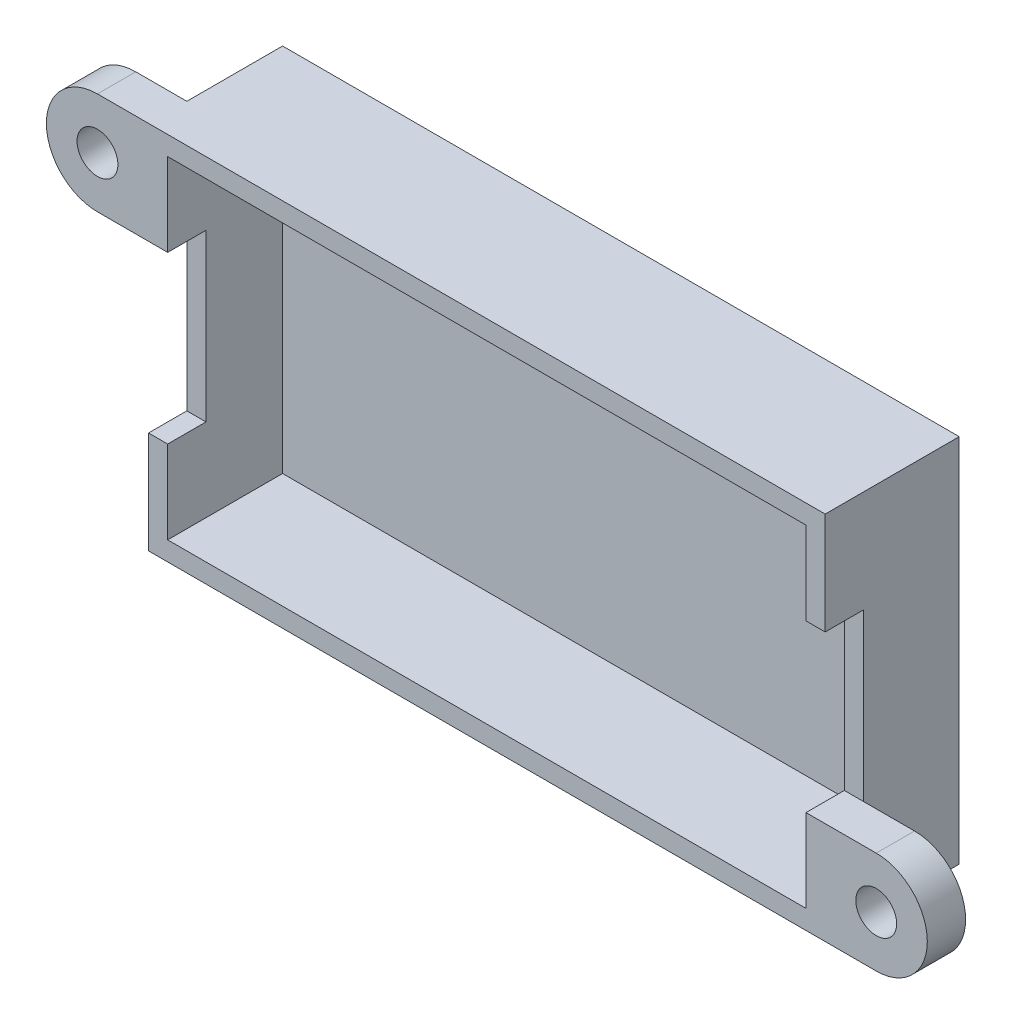
ISO-10303-21;
HEADER;
FILE_DESCRIPTION(('STEP AP214'),'2;1');
FILE_NAME('part.step','',(''),(''),'','','');
FILE_SCHEMA(('AUTOMOTIVE_DESIGN { 1 0 10303 214 1 1 1 1 }'));
ENDSEC;
DATA;
#1=APPLICATION_CONTEXT('core data for automotive mechanical design processes');
#2=APPLICATION_PROTOCOL_DEFINITION('international standard','automotive_design',2000,#1);
#3=PRODUCT_CONTEXT('',#1,'mechanical');
#4=PRODUCT('Part','Part','',(#3));
#5=PRODUCT_RELATED_PRODUCT_CATEGORY('part','',(#4));
#6=PRODUCT_DEFINITION_FORMATION('','',#4);
#7=PRODUCT_DEFINITION_CONTEXT('part definition',#1,'design');
#8=PRODUCT_DEFINITION('design','',#6,#7);
#9=PRODUCT_DEFINITION_SHAPE('','',#8);
#10=(LENGTH_UNIT() NAMED_UNIT(*) SI_UNIT(.MILLI.,.METRE.));
#11=(NAMED_UNIT(*) PLANE_ANGLE_UNIT() SI_UNIT($,.RADIAN.));
#12=(NAMED_UNIT(*) SI_UNIT($,.STERADIAN.) SOLID_ANGLE_UNIT());
#13=UNCERTAINTY_MEASURE_WITH_UNIT(LENGTH_MEASURE(1.E-05),#10,'distance_accuracy_value','');
#14=(GEOMETRIC_REPRESENTATION_CONTEXT(3) GLOBAL_UNCERTAINTY_ASSIGNED_CONTEXT((#13)) GLOBAL_UNIT_ASSIGNED_CONTEXT((#10,
#11,#12)) REPRESENTATION_CONTEXT('',''));
#15=CARTESIAN_POINT('',(0.,0.,0.));
#16=DIRECTION('',(0.,0.,1.));
#17=DIRECTION('',(1.,0.,0.));
#18=AXIS2_PLACEMENT_3D('',#15,#16,#17);
#19=CARTESIAN_POINT('',(0.,0.,10.5));
#20=DIRECTION('',(0.,0.,-1.));
#21=DIRECTION('',(-1.,0.,0.));
#22=AXIS2_PLACEMENT_3D('',#19,#20,#21);
#23=PLANE('',#22);
#24=CARTESIAN_POINT('',(30.5,-10.5,10.5));
#25=DIRECTION('',(0.,0.,1.));
#26=DIRECTION('',(1.,0.,0.));
#27=AXIS2_PLACEMENT_3D('',#24,#25,#26);
#28=CIRCLE('',#27,1.6);
#29=CARTESIAN_POINT('',(32.1,-10.5,10.5));
#30=VERTEX_POINT('',#29);
#31=EDGE_CURVE('E368',#30,#30,#28,.T.);
#32=ORIENTED_EDGE('',*,*,#31,.F.);
#33=EDGE_LOOP('',(#32));
#34=FACE_BOUND('',#33,.T.);
#35=DIRECTION('',(-1.,0.,0.));
#36=VECTOR('',#35,1.);
#37=CARTESIAN_POINT('',(26.5,-6.5,10.5));
#38=LINE('',#37,#36);
#39=CARTESIAN_POINT('',(30.5,-6.5,10.5));
#40=VERTEX_POINT('',#39);
#41=CARTESIAN_POINT('',(25.,-6.5,10.5));
#42=VERTEX_POINT('',#41);
#43=EDGE_CURVE('E354',#40,#42,#38,.T.);
#44=ORIENTED_EDGE('',*,*,#43,.T.);
#45=DIRECTION('',(0.,1.,0.));
#46=VECTOR('',#45,1.);
#47=CARTESIAN_POINT('',(25.,0.,10.5));
#48=LINE('',#47,#46);
#49=CARTESIAN_POINT('',(25.,-13.,10.5));
#50=VERTEX_POINT('',#49);
#51=EDGE_CURVE('E261',#50,#42,#48,.T.);
#52=ORIENTED_EDGE('',*,*,#51,.F.);
#53=DIRECTION('',(1.,0.,0.));
#54=VECTOR('',#53,1.);
#55=CARTESIAN_POINT('',(0.,-13.,10.5));
#56=LINE('',#55,#54);
#57=CARTESIAN_POINT('',(-25.,-13.,10.5));
#58=VERTEX_POINT('',#57);
#59=EDGE_CURVE('E245',#58,#50,#56,.T.);
#60=ORIENTED_EDGE('',*,*,#59,.F.);
#61=DIRECTION('',(0.,-1.,0.));
#62=VECTOR('',#61,1.);
#63=CARTESIAN_POINT('',(-25.,0.,10.5));
#64=LINE('',#63,#62);
#65=CARTESIAN_POINT('',(-25.,-6.5,10.5));
#66=VERTEX_POINT('',#65);
#67=EDGE_CURVE('E268',#66,#58,#64,.T.);
#68=ORIENTED_EDGE('',*,*,#67,.F.);
#69=DIRECTION('',(-1.,0.,0.));
#70=VECTOR('',#69,1.);
#71=CARTESIAN_POINT('',(39.8416640641263,-6.5,10.5));
#72=LINE('',#71,#70);
#73=CARTESIAN_POINT('',(-26.5,-6.5,10.5));
#74=VERTEX_POINT('',#73);
#75=EDGE_CURVE('E656',#66,#74,#72,.T.);
#76=ORIENTED_EDGE('',*,*,#75,.T.);
#77=DIRECTION('',(0.,-1.,0.));
#78=VECTOR('',#77,1.);
#79=CARTESIAN_POINT('',(-26.5,-14.5,10.5));
#80=LINE('',#79,#78);
#81=CARTESIAN_POINT('',(-26.5,-14.5,10.5));
#82=VERTEX_POINT('',#81);
#83=EDGE_CURVE('E282',#74,#82,#80,.T.);
#84=ORIENTED_EDGE('',*,*,#83,.T.);
#85=DIRECTION('',(1.,0.,0.));
#86=VECTOR('',#85,1.);
#87=CARTESIAN_POINT('',(-26.5,-14.5,10.5));
#88=LINE('',#87,#86);
#89=CARTESIAN_POINT('',(30.5,-14.5,10.5));
#90=VERTEX_POINT('',#89);
#91=EDGE_CURVE('E285',#82,#90,#88,.T.);
#92=ORIENTED_EDGE('',*,*,#91,.T.);
#93=CARTESIAN_POINT('',(30.5,-10.5,10.5));
#94=DIRECTION('',(0.,0.,1.));
#95=DIRECTION('',(1.,0.,0.));
#96=AXIS2_PLACEMENT_3D('',#93,#94,#95);
#97=CIRCLE('',#96,4.);
#98=EDGE_CURVE('E357',#90,#40,#97,.T.);
#99=ORIENTED_EDGE('',*,*,#98,.T.);
#100=EDGE_LOOP('',(#44,#52,#60,#68,#76,#84,#92,#99));
#101=FACE_BOUND('',#100,.T.);
#102=ADVANCED_FACE('F41',(#34,#101),#23,.F.);
#103=CARTESIAN_POINT('',(26.5,-14.5,10.5));
#104=DIRECTION('',(-1.,0.,0.));
#105=DIRECTION('',(0.,0.,1.));
#106=AXIS2_PLACEMENT_3D('',#103,#104,#105);
#107=PLANE('',#106);
#108=DIRECTION('',(0.,0.,1.));
#109=VECTOR('',#108,1.);
#110=CARTESIAN_POINT('',(26.5,6.5,10.5));
#111=LINE('',#110,#109);
#112=CARTESIAN_POINT('',(26.5,6.5,7.5));
#113=VERTEX_POINT('',#112);
#114=CARTESIAN_POINT('',(26.5,6.5,10.5));
#115=VERTEX_POINT('',#114);
#116=EDGE_CURVE('E667',#113,#115,#111,.T.);
#117=ORIENTED_EDGE('',*,*,#116,.F.);
#118=DIRECTION('',(0.,1.,0.));
#119=VECTOR('',#118,1.);
#120=CARTESIAN_POINT('',(26.5,6.5,7.5));
#121=LINE('',#120,#119);
#122=CARTESIAN_POINT('',(26.5,-6.5,7.5));
#123=VERTEX_POINT('',#122);
#124=EDGE_CURVE('E669',#123,#113,#121,.T.);
#125=ORIENTED_EDGE('',*,*,#124,.F.);
#126=DIRECTION('',(0.,-1.,0.));
#127=VECTOR('',#126,1.);
#128=CARTESIAN_POINT('',(26.5,-6.5,7.5));
#129=LINE('',#128,#127);
#130=CARTESIAN_POINT('',(26.5,-14.5,7.5));
#131=VERTEX_POINT('',#130);
#132=EDGE_CURVE('E360',#123,#131,#129,.T.);
#133=ORIENTED_EDGE('',*,*,#132,.T.);
#134=DIRECTION('',(0.,0.,-1.));
#135=VECTOR('',#134,1.);
#136=CARTESIAN_POINT('',(26.5,-14.5,10.5));
#137=LINE('',#136,#135);
#138=CARTESIAN_POINT('',(26.5,-14.5,0.));
#139=VERTEX_POINT('',#138);
#140=EDGE_CURVE('E288',#131,#139,#137,.T.);
#141=ORIENTED_EDGE('',*,*,#140,.T.);
#142=DIRECTION('',(0.,1.,0.));
#143=VECTOR('',#142,1.);
#144=CARTESIAN_POINT('',(26.5,-14.5,0.));
#145=LINE('',#144,#143);
#146=CARTESIAN_POINT('',(26.5,14.5,0.));
#147=VERTEX_POINT('',#146);
#148=EDGE_CURVE('E238',#139,#147,#145,.T.);
#149=ORIENTED_EDGE('',*,*,#148,.T.);
#150=DIRECTION('',(0.,0.,-1.));
#151=VECTOR('',#150,1.);
#152=CARTESIAN_POINT('',(26.5,14.5,10.5));
#153=LINE('',#152,#151);
#154=CARTESIAN_POINT('',(26.5,14.5,10.5));
#155=VERTEX_POINT('',#154);
#156=EDGE_CURVE('E311',#155,#147,#153,.T.);
#157=ORIENTED_EDGE('',*,*,#156,.F.);
#158=DIRECTION('',(0.,1.,0.));
#159=VECTOR('',#158,1.);
#160=CARTESIAN_POINT('',(26.5,-14.5,10.5));
#161=LINE('',#160,#159);
#162=EDGE_CURVE('E275',#115,#155,#161,.T.);
#163=ORIENTED_EDGE('',*,*,#162,.F.);
#164=EDGE_LOOP('',(#117,#125,#133,#141,#149,#157,#163));
#165=FACE_BOUND('',#164,.T.);
#166=ADVANCED_FACE('F43',(#165),#107,.F.);
#167=CARTESIAN_POINT('',(-26.5,-14.5,10.5));
#168=DIRECTION('',(1.,0.,0.));
#169=DIRECTION('',(0.,0.,-1.));
#170=AXIS2_PLACEMENT_3D('',#167,#168,#169);
#171=PLANE('',#170);
#172=ORIENTED_EDGE('',*,*,#83,.F.);
#173=DIRECTION('',(0.,0.,1.));
#174=VECTOR('',#173,1.);
#175=CARTESIAN_POINT('',(-26.5,-6.5,10.5));
#176=LINE('',#175,#174);
#177=CARTESIAN_POINT('',(-26.5,-6.5,7.5));
#178=VERTEX_POINT('',#177);
#179=EDGE_CURVE('E196',#178,#74,#176,.T.);
#180=ORIENTED_EDGE('',*,*,#179,.F.);
#181=DIRECTION('',(0.,-1.,0.));
#182=VECTOR('',#181,1.);
#183=CARTESIAN_POINT('',(-26.5,6.5,7.5));
#184=LINE('',#183,#182);
#185=CARTESIAN_POINT('',(-26.5,6.5,7.5));
#186=VERTEX_POINT('',#185);
#187=EDGE_CURVE('E180',#186,#178,#184,.T.);
#188=ORIENTED_EDGE('',*,*,#187,.F.);
#189=DIRECTION('',(0.,1.,0.));
#190=VECTOR('',#189,1.);
#191=CARTESIAN_POINT('',(-26.5,14.5,7.5));
#192=LINE('',#191,#190);
#193=CARTESIAN_POINT('',(-26.5,14.5,7.5));
#194=VERTEX_POINT('',#193);
#195=EDGE_CURVE('E194',#186,#194,#192,.T.);
#196=ORIENTED_EDGE('',*,*,#195,.T.);
#197=DIRECTION('',(0.,0.,-1.));
#198=VECTOR('',#197,1.);
#199=CARTESIAN_POINT('',(-26.5,14.5,10.5));
#200=LINE('',#199,#198);
#201=CARTESIAN_POINT('',(-26.5,14.5,0.));
#202=VERTEX_POINT('',#201);
#203=EDGE_CURVE('E308',#194,#202,#200,.T.);
#204=ORIENTED_EDGE('',*,*,#203,.T.);
#205=DIRECTION('',(0.,-1.,0.));
#206=VECTOR('',#205,1.);
#207=CARTESIAN_POINT('',(-26.5,-14.5,0.));
#208=LINE('',#207,#206);
#209=CARTESIAN_POINT('',(-26.5,-14.5,0.));
#210=VERTEX_POINT('',#209);
#211=EDGE_CURVE('E296',#202,#210,#208,.T.);
#212=ORIENTED_EDGE('',*,*,#211,.T.);
#213=DIRECTION('',(0.,0.,-1.));
#214=VECTOR('',#213,1.);
#215=CARTESIAN_POINT('',(-26.5,-14.5,10.5));
#216=LINE('',#215,#214);
#217=EDGE_CURVE('E304',#82,#210,#216,.T.);
#218=ORIENTED_EDGE('',*,*,#217,.F.);
#219=EDGE_LOOP('',(#172,#180,#188,#196,#204,#212,#218));
#220=FACE_BOUND('',#219,.T.);
#221=ADVANCED_FACE('F193',(#220),#171,.F.);
#222=DIRECTION('',(1.,0.,0.));
#223=VECTOR('',#222,1.);
#224=CARTESIAN_POINT('',(-26.5,6.5,10.5));
#225=LINE('',#224,#223);
#226=CARTESIAN_POINT('',(-30.5,6.5,10.5));
#227=VERTEX_POINT('',#226);
#228=CARTESIAN_POINT('',(-25.,6.5,10.5));
#229=VERTEX_POINT('',#228);
#230=EDGE_CURVE('E203',#227,#229,#225,.T.);
#231=ORIENTED_EDGE('',*,*,#230,.T.);
#232=CARTESIAN_POINT('',(-25.,13.,10.5));
#233=VERTEX_POINT('',#232);
#234=EDGE_CURVE('E269',#233,#229,#64,.T.);
#235=ORIENTED_EDGE('',*,*,#234,.F.);
#236=DIRECTION('',(-1.,0.,0.));
#237=VECTOR('',#236,1.);
#238=CARTESIAN_POINT('',(0.,13.,10.5));
#239=LINE('',#238,#237);
#240=CARTESIAN_POINT('',(25.,13.,10.5));
#241=VERTEX_POINT('',#240);
#242=EDGE_CURVE('E265',#241,#233,#239,.T.);
#243=ORIENTED_EDGE('',*,*,#242,.F.);
#244=CARTESIAN_POINT('',(25.,6.5,10.5));
#245=VERTEX_POINT('',#244);
#246=EDGE_CURVE('E260',#245,#241,#48,.T.);
#247=ORIENTED_EDGE('',*,*,#246,.F.);
#248=DIRECTION('',(-1.,0.,0.));
#249=VECTOR('',#248,1.);
#250=CARTESIAN_POINT('',(39.8416640641263,6.5,10.5));
#251=LINE('',#250,#249);
#252=EDGE_CURVE('E189',#115,#245,#251,.T.);
#253=ORIENTED_EDGE('',*,*,#252,.F.);
#254=ORIENTED_EDGE('',*,*,#162,.T.);
#255=DIRECTION('',(-1.,0.,0.));
#256=VECTOR('',#255,1.);
#257=CARTESIAN_POINT('',(-26.5,14.5,10.5));
#258=LINE('',#257,#256);
#259=CARTESIAN_POINT('',(-30.5,14.5,10.5));
#260=VERTEX_POINT('',#259);
#261=EDGE_CURVE('E278',#155,#260,#258,.T.);
#262=ORIENTED_EDGE('',*,*,#261,.T.);
#263=CARTESIAN_POINT('',(-30.5,10.5,10.5));
#264=DIRECTION('',(0.,0.,1.));
#265=DIRECTION('',(1.,0.,0.));
#266=AXIS2_PLACEMENT_3D('',#263,#264,#265);
#267=CIRCLE('',#266,4.);
#268=EDGE_CURVE('E220',#260,#227,#267,.T.);
#269=ORIENTED_EDGE('',*,*,#268,.T.);
#270=EDGE_LOOP('',(#231,#235,#243,#247,#253,#254,#262,#269));
#271=FACE_BOUND('',#270,.T.);
#272=CARTESIAN_POINT('',(-30.5,10.5,10.5));
#273=DIRECTION('',(0.,0.,1.));
#274=DIRECTION('',(1.,0.,0.));
#275=AXIS2_PLACEMENT_3D('',#272,#273,#274);
#276=CIRCLE('',#275,1.6);
#277=CARTESIAN_POINT('',(-28.9,10.5,10.5));
#278=VERTEX_POINT('',#277);
#279=EDGE_CURVE('E399',#278,#278,#276,.T.);
#280=ORIENTED_EDGE('',*,*,#279,.F.);
#281=EDGE_LOOP('',(#280));
#282=FACE_BOUND('',#281,.T.);
#283=ADVANCED_FACE('F336',(#271,#282),#23,.F.);
#284=CARTESIAN_POINT('',(-26.5,14.5,10.5));
#285=DIRECTION('',(0.,-1.,0.));
#286=DIRECTION('',(0.,0.,-1.));
#287=AXIS2_PLACEMENT_3D('',#284,#285,#286);
#288=PLANE('',#287);
#289=DIRECTION('',(-1.,0.,0.));
#290=VECTOR('',#289,1.);
#291=CARTESIAN_POINT('',(-26.5,14.5,0.));
#292=LINE('',#291,#290);
#293=EDGE_CURVE('E292',#147,#202,#292,.T.);
#294=ORIENTED_EDGE('',*,*,#293,.T.);
#295=ORIENTED_EDGE('',*,*,#203,.F.);
#296=DIRECTION('',(-1.,0.,0.));
#297=VECTOR('',#296,1.);
#298=CARTESIAN_POINT('',(-26.5,14.5,7.5));
#299=LINE('',#298,#297);
#300=CARTESIAN_POINT('',(-30.5,14.5,7.5));
#301=VERTEX_POINT('',#300);
#302=EDGE_CURVE('E65',#194,#301,#299,.T.);
#303=ORIENTED_EDGE('',*,*,#302,.T.);
#304=DIRECTION('',(0.,0.,1.));
#305=VECTOR('',#304,1.);
#306=CARTESIAN_POINT('',(-30.5,14.5,7.5));
#307=LINE('',#306,#305);
#308=EDGE_CURVE('E210',#301,#260,#307,.T.);
#309=ORIENTED_EDGE('',*,*,#308,.T.);
#310=ORIENTED_EDGE('',*,*,#261,.F.);
#311=ORIENTED_EDGE('',*,*,#156,.T.);
#312=EDGE_LOOP('',(#294,#295,#303,#309,#310,#311));
#313=FACE_BOUND('',#312,.T.);
#314=ADVANCED_FACE('F410',(#313),#288,.F.);
#315=CARTESIAN_POINT('',(-26.5,-14.5,10.5));
#316=DIRECTION('',(0.,1.,0.));
#317=DIRECTION('',(0.,0.,1.));
#318=AXIS2_PLACEMENT_3D('',#315,#316,#317);
#319=PLANE('',#318);
#320=DIRECTION('',(1.,0.,0.));
#321=VECTOR('',#320,1.);
#322=CARTESIAN_POINT('',(-26.5,-14.5,0.));
#323=LINE('',#322,#321);
#324=EDGE_CURVE('E279',#210,#139,#323,.T.);
#325=ORIENTED_EDGE('',*,*,#324,.T.);
#326=ORIENTED_EDGE('',*,*,#140,.F.);
#327=DIRECTION('',(1.,0.,0.));
#328=VECTOR('',#327,1.);
#329=CARTESIAN_POINT('',(26.5,-14.5,7.5));
#330=LINE('',#329,#328);
#331=CARTESIAN_POINT('',(30.5,-14.5,7.5));
#332=VERTEX_POINT('',#331);
#333=EDGE_CURVE('E57',#131,#332,#330,.T.);
#334=ORIENTED_EDGE('',*,*,#333,.T.);
#335=DIRECTION('',(0.,0.,1.));
#336=VECTOR('',#335,1.);
#337=CARTESIAN_POINT('',(30.5,-14.5,7.5));
#338=LINE('',#337,#336);
#339=EDGE_CURVE('E393',#332,#90,#338,.T.);
#340=ORIENTED_EDGE('',*,*,#339,.T.);
#341=ORIENTED_EDGE('',*,*,#91,.F.);
#342=ORIENTED_EDGE('',*,*,#217,.T.);
#343=EDGE_LOOP('',(#325,#326,#334,#340,#341,#342));
#344=FACE_BOUND('',#343,.T.);
#345=ADVANCED_FACE('F419',(#344),#319,.F.);
#346=CARTESIAN_POINT('',(0.,0.,0.));
#347=DIRECTION('',(0.,0.,-1.));
#348=DIRECTION('',(-1.,0.,0.));
#349=AXIS2_PLACEMENT_3D('',#346,#347,#348);
#350=PLANE('',#349);
#351=ORIENTED_EDGE('',*,*,#148,.F.);
#352=ORIENTED_EDGE('',*,*,#324,.F.);
#353=ORIENTED_EDGE('',*,*,#211,.F.);
#354=ORIENTED_EDGE('',*,*,#293,.F.);
#355=EDGE_LOOP('',(#351,#352,#353,#354));
#356=FACE_BOUND('',#355,.T.);
#357=ADVANCED_FACE('F422',(#356),#350,.T.);
#358=CARTESIAN_POINT('',(25.,-14.5,10.5));
#359=DIRECTION('',(-1.,0.,0.));
#360=DIRECTION('',(0.,0.,1.));
#361=AXIS2_PLACEMENT_3D('',#358,#359,#360);
#362=PLANE('',#361);
#363=DIRECTION('',(0.,0.,1.));
#364=VECTOR('',#363,1.);
#365=CARTESIAN_POINT('',(25.,-6.5,10.5));
#366=LINE('',#365,#364);
#367=CARTESIAN_POINT('',(25.,-6.5,7.5));
#368=VERTEX_POINT('',#367);
#369=EDGE_CURVE('E363',#368,#42,#366,.T.);
#370=ORIENTED_EDGE('',*,*,#369,.F.);
#371=DIRECTION('',(0.,-1.,0.));
#372=VECTOR('',#371,1.);
#373=CARTESIAN_POINT('',(25.,-14.5,7.5));
#374=LINE('',#373,#372);
#375=CARTESIAN_POINT('',(25.,6.5,7.5));
#376=VERTEX_POINT('',#375);
#377=EDGE_CURVE('E369',#376,#368,#374,.T.);
#378=ORIENTED_EDGE('',*,*,#377,.F.);
#379=DIRECTION('',(0.,0.,-1.));
#380=VECTOR('',#379,1.);
#381=CARTESIAN_POINT('',(25.,6.5,10.5));
#382=LINE('',#381,#380);
#383=EDGE_CURVE('E328',#245,#376,#382,.T.);
#384=ORIENTED_EDGE('',*,*,#383,.F.);
#385=ORIENTED_EDGE('',*,*,#246,.T.);
#386=DIRECTION('',(0.,0.,-1.));
#387=VECTOR('',#386,1.);
#388=CARTESIAN_POINT('',(25.,13.,10.5));
#389=LINE('',#388,#387);
#390=CARTESIAN_POINT('',(25.,13.,1.5));
#391=VERTEX_POINT('',#390);
#392=EDGE_CURVE('E234',#241,#391,#389,.T.);
#393=ORIENTED_EDGE('',*,*,#392,.T.);
#394=DIRECTION('',(0.,1.,0.));
#395=VECTOR('',#394,1.);
#396=CARTESIAN_POINT('',(25.,0.,1.5));
#397=LINE('',#396,#395);
#398=CARTESIAN_POINT('',(25.,-13.,1.5));
#399=VERTEX_POINT('',#398);
#400=EDGE_CURVE('E228',#399,#391,#397,.T.);
#401=ORIENTED_EDGE('',*,*,#400,.F.);
#402=DIRECTION('',(0.,0.,-1.));
#403=VECTOR('',#402,1.);
#404=CARTESIAN_POINT('',(25.,-13.,10.5));
#405=LINE('',#404,#403);
#406=EDGE_CURVE('E240',#50,#399,#405,.T.);
#407=ORIENTED_EDGE('',*,*,#406,.F.);
#408=ORIENTED_EDGE('',*,*,#51,.T.);
#409=EDGE_LOOP('',(#370,#378,#384,#385,#393,#401,#407,#408));
#410=FACE_BOUND('',#409,.T.);
#411=ADVANCED_FACE('F325',(#410),#362,.T.);
#412=CARTESIAN_POINT('',(-26.5,13.,10.5));
#413=DIRECTION('',(0.,-1.,0.));
#414=DIRECTION('',(0.,0.,-1.));
#415=AXIS2_PLACEMENT_3D('',#412,#413,#414);
#416=PLANE('',#415);
#417=DIRECTION('',(-1.,0.,0.));
#418=VECTOR('',#417,1.);
#419=CARTESIAN_POINT('',(0.,13.,1.5));
#420=LINE('',#419,#418);
#421=CARTESIAN_POINT('',(-25.,13.,1.5));
#422=VERTEX_POINT('',#421);
#423=EDGE_CURVE('E233',#391,#422,#420,.T.);
#424=ORIENTED_EDGE('',*,*,#423,.F.);
#425=ORIENTED_EDGE('',*,*,#392,.F.);
#426=ORIENTED_EDGE('',*,*,#242,.T.);
#427=DIRECTION('',(0.,0.,-1.));
#428=VECTOR('',#427,1.);
#429=CARTESIAN_POINT('',(-25.,13.,10.5));
#430=LINE('',#429,#428);
#431=EDGE_CURVE('E239',#233,#422,#430,.T.);
#432=ORIENTED_EDGE('',*,*,#431,.T.);
#433=EDGE_LOOP('',(#424,#425,#426,#432));
#434=FACE_BOUND('',#433,.T.);
#435=ADVANCED_FACE('F333',(#434),#416,.T.);
#436=CARTESIAN_POINT('',(-25.,-14.5,10.5));
#437=DIRECTION('',(1.,0.,0.));
#438=DIRECTION('',(0.,0.,-1.));
#439=AXIS2_PLACEMENT_3D('',#436,#437,#438);
#440=PLANE('',#439);
#441=DIRECTION('',(0.,0.,-1.));
#442=VECTOR('',#441,1.);
#443=CARTESIAN_POINT('',(-25.,-6.5,10.5));
#444=LINE('',#443,#442);
#445=CARTESIAN_POINT('',(-25.,-6.5,7.5));
#446=VERTEX_POINT('',#445);
#447=EDGE_CURVE('E11',#66,#446,#444,.T.);
#448=ORIENTED_EDGE('',*,*,#447,.F.);
#449=ORIENTED_EDGE('',*,*,#67,.T.);
#450=DIRECTION('',(0.,0.,-1.));
#451=VECTOR('',#450,1.);
#452=CARTESIAN_POINT('',(-25.,-13.,10.5));
#453=LINE('',#452,#451);
#454=CARTESIAN_POINT('',(-25.,-13.,1.5));
#455=VERTEX_POINT('',#454);
#456=EDGE_CURVE('E244',#58,#455,#453,.T.);
#457=ORIENTED_EDGE('',*,*,#456,.T.);
#458=DIRECTION('',(0.,-1.,0.));
#459=VECTOR('',#458,1.);
#460=CARTESIAN_POINT('',(-25.,0.,1.5));
#461=LINE('',#460,#459);
#462=EDGE_CURVE('E248',#422,#455,#461,.T.);
#463=ORIENTED_EDGE('',*,*,#462,.F.);
#464=ORIENTED_EDGE('',*,*,#431,.F.);
#465=ORIENTED_EDGE('',*,*,#234,.T.);
#466=DIRECTION('',(0.,0.,1.));
#467=VECTOR('',#466,1.);
#468=CARTESIAN_POINT('',(-25.,6.5,10.5));
#469=LINE('',#468,#467);
#470=CARTESIAN_POINT('',(-25.,6.5,7.5));
#471=VERTEX_POINT('',#470);
#472=EDGE_CURVE('E315',#471,#229,#469,.T.);
#473=ORIENTED_EDGE('',*,*,#472,.F.);
#474=DIRECTION('',(0.,1.,0.));
#475=VECTOR('',#474,1.);
#476=CARTESIAN_POINT('',(-25.,-14.5,7.5));
#477=LINE('',#476,#475);
#478=EDGE_CURVE('E50',#446,#471,#477,.T.);
#479=ORIENTED_EDGE('',*,*,#478,.F.);
#480=EDGE_LOOP('',(#448,#449,#457,#463,#464,#465,#473,#479));
#481=FACE_BOUND('',#480,.T.);
#482=ADVANCED_FACE('F340',(#481),#440,.T.);
#483=CARTESIAN_POINT('',(-26.5,-13.,10.5));
#484=DIRECTION('',(0.,1.,0.));
#485=DIRECTION('',(0.,0.,1.));
#486=AXIS2_PLACEMENT_3D('',#483,#484,#485);
#487=PLANE('',#486);
#488=DIRECTION('',(1.,0.,0.));
#489=VECTOR('',#488,1.);
#490=CARTESIAN_POINT('',(0.,-13.,1.5));
#491=LINE('',#490,#489);
#492=EDGE_CURVE('E254',#455,#399,#491,.T.);
#493=ORIENTED_EDGE('',*,*,#492,.F.);
#494=ORIENTED_EDGE('',*,*,#456,.F.);
#495=ORIENTED_EDGE('',*,*,#59,.T.);
#496=ORIENTED_EDGE('',*,*,#406,.T.);
#497=EDGE_LOOP('',(#493,#494,#495,#496));
#498=FACE_BOUND('',#497,.T.);
#499=ADVANCED_FACE('F479',(#498),#487,.T.);
#500=CARTESIAN_POINT('',(0.,0.,1.5));
#501=DIRECTION('',(0.,0.,-1.));
#502=DIRECTION('',(-1.,0.,0.));
#503=AXIS2_PLACEMENT_3D('',#500,#501,#502);
#504=PLANE('',#503);
#505=ORIENTED_EDGE('',*,*,#400,.T.);
#506=ORIENTED_EDGE('',*,*,#423,.T.);
#507=ORIENTED_EDGE('',*,*,#462,.T.);
#508=ORIENTED_EDGE('',*,*,#492,.T.);
#509=EDGE_LOOP('',(#505,#506,#507,#508));
#510=FACE_BOUND('',#509,.T.);
#511=ADVANCED_FACE('F345',(#510),#504,.F.);
#512=CARTESIAN_POINT('',(-26.5,6.5,7.5));
#513=DIRECTION('',(0.,-1.,0.));
#514=DIRECTION('',(1.,0.,0.));
#515=AXIS2_PLACEMENT_3D('',#512,#513,#514);
#516=PLANE('',#515);
#517=ORIENTED_EDGE('',*,*,#230,.F.);
#518=DIRECTION('',(0.,0.,1.));
#519=VECTOR('',#518,1.);
#520=CARTESIAN_POINT('',(-30.5,6.5,7.5));
#521=LINE('',#520,#519);
#522=CARTESIAN_POINT('',(-30.5,6.5,7.5));
#523=VERTEX_POINT('',#522);
#524=EDGE_CURVE('E207',#523,#227,#521,.T.);
#525=ORIENTED_EDGE('',*,*,#524,.F.);
#526=DIRECTION('',(1.,0.,0.));
#527=VECTOR('',#526,1.);
#528=CARTESIAN_POINT('',(-26.5,6.5,7.5));
#529=LINE('',#528,#527);
#530=EDGE_CURVE('E201',#523,#186,#529,.T.);
#531=ORIENTED_EDGE('',*,*,#530,.T.);
#532=DIRECTION('',(-1.,0.,0.));
#533=VECTOR('',#532,1.);
#534=CARTESIAN_POINT('',(39.8416640641263,6.5,7.5));
#535=LINE('',#534,#533);
#536=EDGE_CURVE('E176',#471,#186,#535,.T.);
#537=ORIENTED_EDGE('',*,*,#536,.F.);
#538=ORIENTED_EDGE('',*,*,#472,.T.);
#539=EDGE_LOOP('',(#517,#525,#531,#537,#538));
#540=FACE_BOUND('',#539,.T.);
#541=ADVANCED_FACE('F206',(#540),#516,.T.);
#542=CARTESIAN_POINT('',(-30.5,10.5,7.5));
#543=DIRECTION('',(0.,0.,1.));
#544=DIRECTION('',(1.,0.,0.));
#545=AXIS2_PLACEMENT_3D('',#542,#543,#544);
#546=CYLINDRICAL_SURFACE('',#545,4.);
#547=ORIENTED_EDGE('',*,*,#268,.F.);
#548=ORIENTED_EDGE('',*,*,#308,.F.);
#549=CARTESIAN_POINT('',(-30.5,10.5,7.5));
#550=DIRECTION('',(0.,0.,1.));
#551=DIRECTION('',(1.,0.,0.));
#552=AXIS2_PLACEMENT_3D('',#549,#550,#551);
#553=CIRCLE('',#552,4.);
#554=EDGE_CURVE('E211',#301,#523,#553,.T.);
#555=ORIENTED_EDGE('',*,*,#554,.T.);
#556=ORIENTED_EDGE('',*,*,#524,.T.);
#557=EDGE_LOOP('',(#547,#548,#555,#556));
#558=FACE_BOUND('',#557,.T.);
#559=ADVANCED_FACE('F474',(#558),#546,.T.);
#560=CARTESIAN_POINT('',(-30.5,10.5,7.5));
#561=DIRECTION('',(0.,0.,1.));
#562=DIRECTION('',(1.,0.,0.));
#563=AXIS2_PLACEMENT_3D('',#560,#561,#562);
#564=PLANE('',#563);
#565=CARTESIAN_POINT('',(-30.5,10.5,7.5));
#566=DIRECTION('',(0.,0.,1.));
#567=DIRECTION('',(1.,0.,0.));
#568=AXIS2_PLACEMENT_3D('',#565,#566,#567);
#569=CIRCLE('',#568,1.6);
#570=CARTESIAN_POINT('',(-28.9,10.5,7.5));
#571=VERTEX_POINT('',#570);
#572=EDGE_CURVE('E224',#571,#571,#569,.T.);
#573=ORIENTED_EDGE('',*,*,#572,.T.);
#574=EDGE_LOOP('',(#573));
#575=FACE_BOUND('',#574,.T.);
#576=ORIENTED_EDGE('',*,*,#195,.F.);
#577=ORIENTED_EDGE('',*,*,#530,.F.);
#578=ORIENTED_EDGE('',*,*,#554,.F.);
#579=ORIENTED_EDGE('',*,*,#302,.F.);
#580=EDGE_LOOP('',(#576,#577,#578,#579));
#581=FACE_BOUND('',#580,.T.);
#582=ADVANCED_FACE('F200',(#575,#581),#564,.F.);
#583=CARTESIAN_POINT('',(-30.5,10.5,7.5));
#584=DIRECTION('',(0.,0.,1.));
#585=DIRECTION('',(1.,0.,0.));
#586=AXIS2_PLACEMENT_3D('',#583,#584,#585);
#587=CYLINDRICAL_SURFACE('',#586,1.6);
#588=ORIENTED_EDGE('',*,*,#572,.F.);
#589=EDGE_LOOP('',(#588));
#590=FACE_BOUND('',#589,.T.);
#591=ORIENTED_EDGE('',*,*,#279,.T.);
#592=EDGE_LOOP('',(#591));
#593=FACE_BOUND('',#592,.T.);
#594=ADVANCED_FACE('F492',(#590,#593),#587,.F.);
#595=CARTESIAN_POINT('',(26.5,-6.5,7.5));
#596=DIRECTION('',(0.,1.,0.));
#597=DIRECTION('',(0.,0.,1.));
#598=AXIS2_PLACEMENT_3D('',#595,#596,#597);
#599=PLANE('',#598);
#600=ORIENTED_EDGE('',*,*,#43,.F.);
#601=DIRECTION('',(0.,0.,1.));
#602=VECTOR('',#601,1.);
#603=CARTESIAN_POINT('',(30.5,-6.5,7.5));
#604=LINE('',#603,#602);
#605=CARTESIAN_POINT('',(30.5,-6.5,7.5));
#606=VERTEX_POINT('',#605);
#607=EDGE_CURVE('E396',#606,#40,#604,.T.);
#608=ORIENTED_EDGE('',*,*,#607,.F.);
#609=DIRECTION('',(-1.,0.,0.));
#610=VECTOR('',#609,1.);
#611=CARTESIAN_POINT('',(26.5,-6.5,7.5));
#612=LINE('',#611,#610);
#613=EDGE_CURVE('E390',#606,#123,#612,.T.);
#614=ORIENTED_EDGE('',*,*,#613,.T.);
#615=DIRECTION('',(-1.,0.,0.));
#616=VECTOR('',#615,1.);
#617=CARTESIAN_POINT('',(39.8416640641263,-6.5,7.5));
#618=LINE('',#617,#616);
#619=EDGE_CURVE('E366',#123,#368,#618,.T.);
#620=ORIENTED_EDGE('',*,*,#619,.T.);
#621=ORIENTED_EDGE('',*,*,#369,.T.);
#622=EDGE_LOOP('',(#600,#608,#614,#620,#621));
#623=FACE_BOUND('',#622,.T.);
#624=ADVANCED_FACE('F364',(#623),#599,.T.);
#625=CARTESIAN_POINT('',(30.5,-10.5,7.5));
#626=DIRECTION('',(0.,0.,1.));
#627=DIRECTION('',(1.,0.,0.));
#628=AXIS2_PLACEMENT_3D('',#625,#626,#627);
#629=CYLINDRICAL_SURFACE('',#628,4.);
#630=ORIENTED_EDGE('',*,*,#98,.F.);
#631=ORIENTED_EDGE('',*,*,#339,.F.);
#632=CARTESIAN_POINT('',(30.5,-10.5,7.5));
#633=DIRECTION('',(0.,0.,1.));
#634=DIRECTION('',(1.,0.,0.));
#635=AXIS2_PLACEMENT_3D('',#632,#633,#634);
#636=CIRCLE('',#635,4.);
#637=EDGE_CURVE('E386',#332,#606,#636,.T.);
#638=ORIENTED_EDGE('',*,*,#637,.T.);
#639=ORIENTED_EDGE('',*,*,#607,.T.);
#640=EDGE_LOOP('',(#630,#631,#638,#639));
#641=FACE_BOUND('',#640,.T.);
#642=ADVANCED_FACE('F429',(#641),#629,.T.);
#643=CARTESIAN_POINT('',(30.5,-10.5,7.5));
#644=DIRECTION('',(0.,0.,1.));
#645=DIRECTION('',(1.,0.,0.));
#646=AXIS2_PLACEMENT_3D('',#643,#644,#645);
#647=PLANE('',#646);
#648=CARTESIAN_POINT('',(30.5,-10.5,7.5));
#649=DIRECTION('',(0.,0.,1.));
#650=DIRECTION('',(1.,0.,0.));
#651=AXIS2_PLACEMENT_3D('',#648,#649,#650);
#652=CIRCLE('',#651,1.6);
#653=CARTESIAN_POINT('',(32.1,-10.5,7.5));
#654=VERTEX_POINT('',#653);
#655=EDGE_CURVE('E374',#654,#654,#652,.T.);
#656=ORIENTED_EDGE('',*,*,#655,.T.);
#657=EDGE_LOOP('',(#656));
#658=FACE_BOUND('',#657,.T.);
#659=ORIENTED_EDGE('',*,*,#132,.F.);
#660=ORIENTED_EDGE('',*,*,#613,.F.);
#661=ORIENTED_EDGE('',*,*,#637,.F.);
#662=ORIENTED_EDGE('',*,*,#333,.F.);
#663=EDGE_LOOP('',(#659,#660,#661,#662));
#664=FACE_BOUND('',#663,.T.);
#665=ADVANCED_FACE('F431',(#658,#664),#647,.F.);
#666=CARTESIAN_POINT('',(30.5,-10.5,7.5));
#667=DIRECTION('',(0.,0.,1.));
#668=DIRECTION('',(1.,0.,0.));
#669=AXIS2_PLACEMENT_3D('',#666,#667,#668);
#670=CYLINDRICAL_SURFACE('',#669,1.6);
#671=ORIENTED_EDGE('',*,*,#655,.F.);
#672=EDGE_LOOP('',(#671));
#673=FACE_BOUND('',#672,.T.);
#674=ORIENTED_EDGE('',*,*,#31,.T.);
#675=EDGE_LOOP('',(#674));
#676=FACE_BOUND('',#675,.T.);
#677=ADVANCED_FACE('F433',(#673,#676),#670,.F.);
#678=CARTESIAN_POINT('',(39.8416640641263,6.5,10.5));
#679=DIRECTION('',(0.,1.,0.));
#680=DIRECTION('',(0.,0.,1.));
#681=AXIS2_PLACEMENT_3D('',#678,#679,#680);
#682=PLANE('',#681);
#683=ORIENTED_EDGE('',*,*,#383,.T.);
#684=EDGE_CURVE('E188',#113,#376,#535,.T.);
#685=ORIENTED_EDGE('',*,*,#684,.F.);
#686=ORIENTED_EDGE('',*,*,#116,.T.);
#687=ORIENTED_EDGE('',*,*,#252,.T.);
#688=EDGE_LOOP('',(#683,#685,#686,#687));
#689=FACE_BOUND('',#688,.T.);
#690=ADVANCED_FACE('F440',(#689),#682,.F.);
#691=CARTESIAN_POINT('',(39.8416640641263,6.5,7.5));
#692=DIRECTION('',(0.,0.,-1.));
#693=DIRECTION('',(-1.,0.,0.));
#694=AXIS2_PLACEMENT_3D('',#691,#692,#693);
#695=PLANE('',#694);
#696=ORIENTED_EDGE('',*,*,#377,.T.);
#697=ORIENTED_EDGE('',*,*,#619,.F.);
#698=ORIENTED_EDGE('',*,*,#124,.T.);
#699=ORIENTED_EDGE('',*,*,#684,.T.);
#700=EDGE_LOOP('',(#696,#697,#698,#699));
#701=FACE_BOUND('',#700,.T.);
#702=ADVANCED_FACE('F624',(#701),#695,.F.);
#703=CARTESIAN_POINT('',(39.8416640641263,-6.5,10.5));
#704=DIRECTION('',(0.,-1.,0.));
#705=DIRECTION('',(0.,0.,-1.));
#706=AXIS2_PLACEMENT_3D('',#703,#704,#705);
#707=PLANE('',#706);
#708=ORIENTED_EDGE('',*,*,#447,.T.);
#709=EDGE_CURVE('E654',#446,#178,#618,.T.);
#710=ORIENTED_EDGE('',*,*,#709,.T.);
#711=ORIENTED_EDGE('',*,*,#179,.T.);
#712=ORIENTED_EDGE('',*,*,#75,.F.);
#713=EDGE_LOOP('',(#708,#710,#711,#712));
#714=FACE_BOUND('',#713,.T.);
#715=ADVANCED_FACE('F633',(#714),#707,.F.);
#716=ORIENTED_EDGE('',*,*,#478,.T.);
#717=ORIENTED_EDGE('',*,*,#536,.T.);
#718=ORIENTED_EDGE('',*,*,#187,.T.);
#719=ORIENTED_EDGE('',*,*,#709,.F.);
#720=EDGE_LOOP('',(#716,#717,#718,#719));
#721=FACE_BOUND('',#720,.T.);
#722=ADVANCED_FACE('F178',(#721),#695,.F.);
#723=CLOSED_SHELL('',(#102,#166,#221,#283,#314,#345,#357,#411,#435,#482,#499,#511,#541,#559,
#582,#594,#624,#642,#665,#677,#690,#702,#715,#722));
#724=MANIFOLD_SOLID_BREP('B2',#723);
#725=ADVANCED_BREP_SHAPE_REPRESENTATION('',(#18,#724),#14);
#726=SHAPE_DEFINITION_REPRESENTATION(#9,#725);
ENDSEC;
END-ISO-10303-21;
